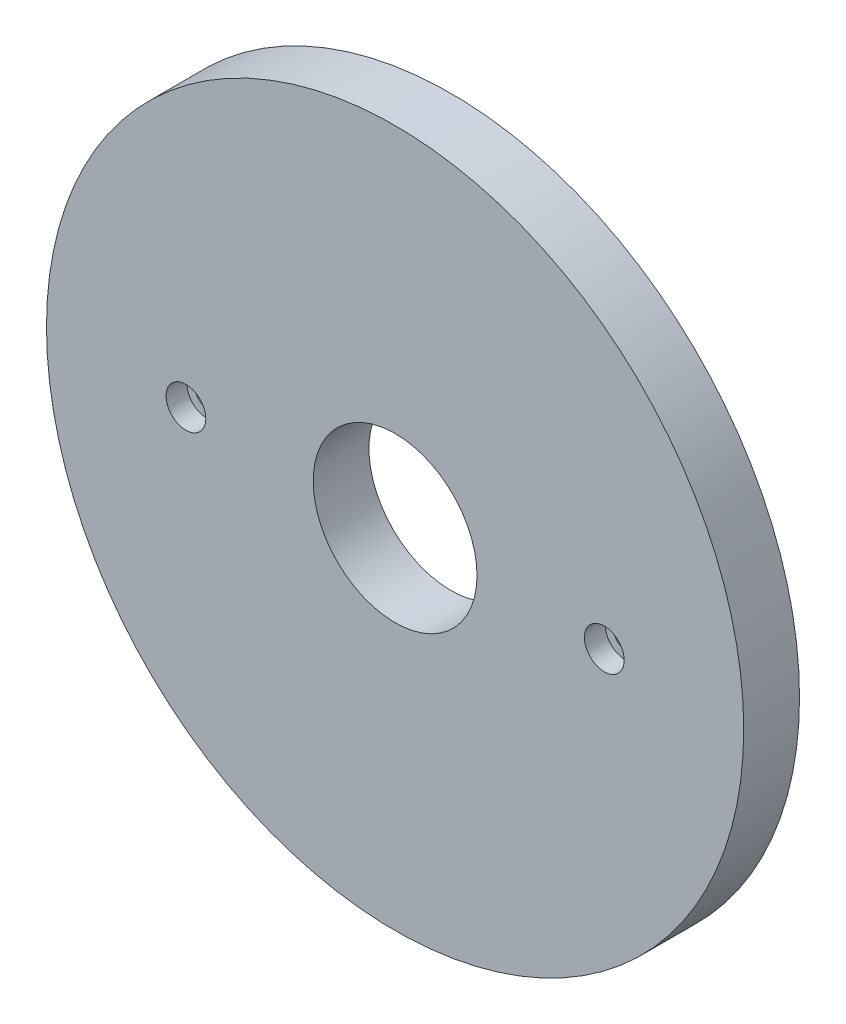
ISO-10303-21;
HEADER;
FILE_DESCRIPTION(('STEP AP214'),'2;1');
FILE_NAME('part.step','',(''),(''),'','','');
FILE_SCHEMA(('AUTOMOTIVE_DESIGN { 1 0 10303 214 1 1 1 1 }'));
ENDSEC;
DATA;
#1=APPLICATION_CONTEXT('core data for automotive mechanical design processes');
#2=APPLICATION_PROTOCOL_DEFINITION('international standard','automotive_design',2000,#1);
#3=PRODUCT_CONTEXT('',#1,'mechanical');
#4=PRODUCT('Part','Part','',(#3));
#5=PRODUCT_RELATED_PRODUCT_CATEGORY('part','',(#4));
#6=PRODUCT_DEFINITION_FORMATION('','',#4);
#7=PRODUCT_DEFINITION_CONTEXT('part definition',#1,'design');
#8=PRODUCT_DEFINITION('design','',#6,#7);
#9=PRODUCT_DEFINITION_SHAPE('','',#8);
#10=(LENGTH_UNIT() NAMED_UNIT(*) SI_UNIT(.MILLI.,.METRE.));
#11=(NAMED_UNIT(*) PLANE_ANGLE_UNIT() SI_UNIT($,.RADIAN.));
#12=(NAMED_UNIT(*) SI_UNIT($,.STERADIAN.) SOLID_ANGLE_UNIT());
#13=UNCERTAINTY_MEASURE_WITH_UNIT(LENGTH_MEASURE(1.E-05),#10,'distance_accuracy_value','');
#14=(GEOMETRIC_REPRESENTATION_CONTEXT(3) GLOBAL_UNCERTAINTY_ASSIGNED_CONTEXT((#13)) GLOBAL_UNIT_ASSIGNED_CONTEXT((#10,
#11,#12)) REPRESENTATION_CONTEXT('',''));
#15=CARTESIAN_POINT('',(0.,0.,0.));
#16=DIRECTION('',(0.,0.,1.));
#17=DIRECTION('',(1.,0.,0.));
#18=AXIS2_PLACEMENT_3D('',#15,#16,#17);
#19=CARTESIAN_POINT('',(-30.,0.,-8.));
#20=DIRECTION('',(0.,0.,1.));
#21=DIRECTION('',(1.,0.,0.));
#22=AXIS2_PLACEMENT_3D('',#19,#20,#21);
#23=CYLINDRICAL_SURFACE('',#22,1.6);
#24=CARTESIAN_POINT('',(-30.,0.,-8.));
#25=DIRECTION('',(0.,0.,1.));
#26=DIRECTION('',(1.,0.,0.));
#27=AXIS2_PLACEMENT_3D('',#24,#25,#26);
#28=CIRCLE('',#27,1.6);
#29=CARTESIAN_POINT('',(-28.4,0.,-8.));
#30=VERTEX_POINT('',#29);
#31=EDGE_CURVE('E55',#30,#30,#28,.T.);
#32=ORIENTED_EDGE('',*,*,#31,.F.);
#33=EDGE_LOOP('',(#32));
#34=FACE_BOUND('',#33,.T.);
#35=CARTESIAN_POINT('',(-30.,0.,-3.));
#36=DIRECTION('',(0.,0.,1.));
#37=DIRECTION('',(1.,0.,0.));
#38=AXIS2_PLACEMENT_3D('',#35,#36,#37);
#39=CIRCLE('',#38,1.6);
#40=CARTESIAN_POINT('',(-28.4,0.,-3.));
#41=VERTEX_POINT('',#40);
#42=EDGE_CURVE('E35',#41,#41,#39,.F.);
#43=ORIENTED_EDGE('',*,*,#42,.F.);
#44=EDGE_LOOP('',(#43));
#45=FACE_BOUND('',#44,.T.);
#46=ADVANCED_FACE('F31',(#34,#45),#23,.F.);
#47=CARTESIAN_POINT('',(30.,0.,-8.));
#48=DIRECTION('',(0.,0.,1.));
#49=DIRECTION('',(1.,0.,0.));
#50=AXIS2_PLACEMENT_3D('',#47,#48,#49);
#51=CYLINDRICAL_SURFACE('',#50,1.6);
#52=CARTESIAN_POINT('',(30.,0.,-8.));
#53=DIRECTION('',(0.,0.,1.));
#54=DIRECTION('',(1.,0.,0.));
#55=AXIS2_PLACEMENT_3D('',#52,#53,#54);
#56=CIRCLE('',#55,1.6);
#57=CARTESIAN_POINT('',(31.6,0.,-8.));
#58=VERTEX_POINT('',#57);
#59=EDGE_CURVE('E70',#58,#58,#56,.T.);
#60=ORIENTED_EDGE('',*,*,#59,.F.);
#61=EDGE_LOOP('',(#60));
#62=FACE_BOUND('',#61,.T.);
#63=CARTESIAN_POINT('',(30.,0.,-3.));
#64=DIRECTION('',(0.,0.,1.));
#65=DIRECTION('',(1.,0.,0.));
#66=AXIS2_PLACEMENT_3D('',#63,#64,#65);
#67=CIRCLE('',#66,1.6);
#68=CARTESIAN_POINT('',(31.6,0.,-3.));
#69=VERTEX_POINT('',#68);
#70=EDGE_CURVE('E49',#69,#69,#67,.F.);
#71=ORIENTED_EDGE('',*,*,#70,.F.);
#72=EDGE_LOOP('',(#71));
#73=FACE_BOUND('',#72,.T.);
#74=ADVANCED_FACE('F90',(#62,#73),#51,.F.);
#75=CARTESIAN_POINT('',(0.,0.,-8.));
#76=DIRECTION('',(0.,0.,1.));
#77=DIRECTION('',(1.,0.,0.));
#78=AXIS2_PLACEMENT_3D('',#75,#76,#77);
#79=CYLINDRICAL_SURFACE('',#78,50.);
#80=CARTESIAN_POINT('',(0.,0.,-8.));
#81=DIRECTION('',(0.,0.,1.));
#82=DIRECTION('',(1.,0.,0.));
#83=AXIS2_PLACEMENT_3D('',#80,#81,#82);
#84=CIRCLE('',#83,50.);
#85=CARTESIAN_POINT('',(50.,0.,-8.));
#86=VERTEX_POINT('',#85);
#87=EDGE_CURVE('E10',#86,#86,#84,.T.);
#88=ORIENTED_EDGE('',*,*,#87,.T.);
#89=EDGE_LOOP('',(#88));
#90=FACE_BOUND('',#89,.T.);
#91=CARTESIAN_POINT('',(0.,0.,0.));
#92=DIRECTION('',(0.,0.,1.));
#93=DIRECTION('',(1.,0.,0.));
#94=AXIS2_PLACEMENT_3D('',#91,#92,#93);
#95=CIRCLE('',#94,50.);
#96=CARTESIAN_POINT('',(50.,0.,0.));
#97=VERTEX_POINT('',#96);
#98=EDGE_CURVE('E39',#97,#97,#95,.T.);
#99=ORIENTED_EDGE('',*,*,#98,.F.);
#100=EDGE_LOOP('',(#99));
#101=FACE_BOUND('',#100,.T.);
#102=ADVANCED_FACE('F33',(#90,#101),#79,.T.);
#103=CARTESIAN_POINT('',(0.,0.,-8.));
#104=DIRECTION('',(0.,0.,1.));
#105=DIRECTION('',(1.,0.,0.));
#106=AXIS2_PLACEMENT_3D('',#103,#104,#105);
#107=PLANE('',#106);
#108=ORIENTED_EDGE('',*,*,#59,.T.);
#109=EDGE_LOOP('',(#108));
#110=FACE_BOUND('',#109,.T.);
#111=ORIENTED_EDGE('',*,*,#31,.T.);
#112=EDGE_LOOP('',(#111));
#113=FACE_BOUND('',#112,.T.);
#114=CARTESIAN_POINT('',(0.,0.,-8.));
#115=DIRECTION('',(0.,0.,1.));
#116=DIRECTION('',(1.,0.,0.));
#117=AXIS2_PLACEMENT_3D('',#114,#115,#116);
#118=CIRCLE('',#117,11.75);
#119=CARTESIAN_POINT('',(11.75,0.,-8.));
#120=VERTEX_POINT('',#119);
#121=EDGE_CURVE('E44',#120,#120,#118,.T.);
#122=ORIENTED_EDGE('',*,*,#121,.T.);
#123=EDGE_LOOP('',(#122));
#124=FACE_BOUND('',#123,.T.);
#125=ORIENTED_EDGE('',*,*,#87,.F.);
#126=EDGE_LOOP('',(#125));
#127=FACE_BOUND('',#126,.T.);
#128=ADVANCED_FACE('F85',(#110,#113,#124,#127),#107,.F.);
#129=CARTESIAN_POINT('',(0.,0.,0.));
#130=DIRECTION('',(0.,0.,1.));
#131=DIRECTION('',(1.,0.,0.));
#132=AXIS2_PLACEMENT_3D('',#129,#130,#131);
#133=PLANE('',#132);
#134=CARTESIAN_POINT('',(30.,0.,0.));
#135=DIRECTION('',(0.,0.,1.));
#136=DIRECTION('',(1.,0.,0.));
#137=AXIS2_PLACEMENT_3D('',#134,#135,#136);
#138=CIRCLE('',#137,2.85);
#139=CARTESIAN_POINT('',(32.85,0.,0.));
#140=VERTEX_POINT('',#139);
#141=EDGE_CURVE('E57',#140,#140,#138,.T.);
#142=ORIENTED_EDGE('',*,*,#141,.F.);
#143=EDGE_LOOP('',(#142));
#144=FACE_BOUND('',#143,.T.);
#145=CARTESIAN_POINT('',(-30.,0.,0.));
#146=DIRECTION('',(0.,0.,1.));
#147=DIRECTION('',(1.,0.,0.));
#148=AXIS2_PLACEMENT_3D('',#145,#146,#147);
#149=CIRCLE('',#148,2.85);
#150=CARTESIAN_POINT('',(-27.15,0.,0.));
#151=VERTEX_POINT('',#150);
#152=EDGE_CURVE('E67',#151,#151,#149,.T.);
#153=ORIENTED_EDGE('',*,*,#152,.F.);
#154=EDGE_LOOP('',(#153));
#155=FACE_BOUND('',#154,.T.);
#156=CARTESIAN_POINT('',(0.,0.,0.));
#157=DIRECTION('',(0.,0.,1.));
#158=DIRECTION('',(1.,0.,0.));
#159=AXIS2_PLACEMENT_3D('',#156,#157,#158);
#160=CIRCLE('',#159,11.75);
#161=CARTESIAN_POINT('',(11.75,0.,0.));
#162=VERTEX_POINT('',#161);
#163=EDGE_CURVE('E47',#162,#162,#160,.T.);
#164=ORIENTED_EDGE('',*,*,#163,.F.);
#165=EDGE_LOOP('',(#164));
#166=FACE_BOUND('',#165,.T.);
#167=ORIENTED_EDGE('',*,*,#98,.T.);
#168=EDGE_LOOP('',(#167));
#169=FACE_BOUND('',#168,.T.);
#170=ADVANCED_FACE('F82',(#144,#155,#166,#169),#133,.T.);
#171=CARTESIAN_POINT('',(0.,0.,-8.));
#172=DIRECTION('',(0.,0.,1.));
#173=DIRECTION('',(1.,0.,0.));
#174=AXIS2_PLACEMENT_3D('',#171,#172,#173);
#175=CYLINDRICAL_SURFACE('',#174,11.75);
#176=ORIENTED_EDGE('',*,*,#121,.F.);
#177=EDGE_LOOP('',(#176));
#178=FACE_BOUND('',#177,.T.);
#179=ORIENTED_EDGE('',*,*,#163,.T.);
#180=EDGE_LOOP('',(#179));
#181=FACE_BOUND('',#180,.T.);
#182=ADVANCED_FACE('F80',(#178,#181),#175,.F.);
#183=CARTESIAN_POINT('',(30.,0.,-3.));
#184=DIRECTION('',(0.,0.,1.));
#185=DIRECTION('',(1.,0.,0.));
#186=AXIS2_PLACEMENT_3D('',#183,#184,#185);
#187=PLANE('',#186);
#188=CARTESIAN_POINT('',(30.,0.,-3.));
#189=DIRECTION('',(0.,0.,1.));
#190=DIRECTION('',(1.,0.,0.));
#191=AXIS2_PLACEMENT_3D('',#188,#189,#190);
#192=CIRCLE('',#191,2.85);
#193=CARTESIAN_POINT('',(32.85,0.,-3.));
#194=VERTEX_POINT('',#193);
#195=EDGE_CURVE('E51',#194,#194,#192,.T.);
#196=ORIENTED_EDGE('',*,*,#195,.T.);
#197=EDGE_LOOP('',(#196));
#198=FACE_BOUND('',#197,.T.);
#199=ORIENTED_EDGE('',*,*,#70,.T.);
#200=EDGE_LOOP('',(#199));
#201=FACE_BOUND('',#200,.T.);
#202=ADVANCED_FACE('F109',(#198,#201),#187,.T.);
#203=CARTESIAN_POINT('',(30.,0.,-3.));
#204=DIRECTION('',(0.,0.,1.));
#205=DIRECTION('',(1.,0.,0.));
#206=AXIS2_PLACEMENT_3D('',#203,#204,#205);
#207=CYLINDRICAL_SURFACE('',#206,2.85);
#208=ORIENTED_EDGE('',*,*,#195,.F.);
#209=EDGE_LOOP('',(#208));
#210=FACE_BOUND('',#209,.T.);
#211=ORIENTED_EDGE('',*,*,#141,.T.);
#212=EDGE_LOOP('',(#211));
#213=FACE_BOUND('',#212,.T.);
#214=ADVANCED_FACE('F114',(#210,#213),#207,.F.);
#215=CARTESIAN_POINT('',(-30.,0.,-3.));
#216=DIRECTION('',(0.,0.,1.));
#217=DIRECTION('',(1.,0.,0.));
#218=AXIS2_PLACEMENT_3D('',#215,#216,#217);
#219=PLANE('',#218);
#220=CARTESIAN_POINT('',(-30.,0.,-3.));
#221=DIRECTION('',(0.,0.,1.));
#222=DIRECTION('',(1.,0.,0.));
#223=AXIS2_PLACEMENT_3D('',#220,#221,#222);
#224=CIRCLE('',#223,2.85);
#225=CARTESIAN_POINT('',(-27.15,0.,-3.));
#226=VERTEX_POINT('',#225);
#227=EDGE_CURVE('E62',#226,#226,#224,.T.);
#228=ORIENTED_EDGE('',*,*,#227,.T.);
#229=EDGE_LOOP('',(#228));
#230=FACE_BOUND('',#229,.T.);
#231=ORIENTED_EDGE('',*,*,#42,.T.);
#232=EDGE_LOOP('',(#231));
#233=FACE_BOUND('',#232,.T.);
#234=ADVANCED_FACE('F119',(#230,#233),#219,.T.);
#235=CARTESIAN_POINT('',(-30.,0.,-3.));
#236=DIRECTION('',(0.,0.,1.));
#237=DIRECTION('',(1.,0.,0.));
#238=AXIS2_PLACEMENT_3D('',#235,#236,#237);
#239=CYLINDRICAL_SURFACE('',#238,2.85);
#240=ORIENTED_EDGE('',*,*,#227,.F.);
#241=EDGE_LOOP('',(#240));
#242=FACE_BOUND('',#241,.T.);
#243=ORIENTED_EDGE('',*,*,#152,.T.);
#244=EDGE_LOOP('',(#243));
#245=FACE_BOUND('',#244,.T.);
#246=ADVANCED_FACE('F124',(#242,#245),#239,.F.);
#247=CLOSED_SHELL('',(#46,#74,#102,#128,#170,#182,#202,#214,#234,#246));
#248=MANIFOLD_SOLID_BREP('B2',#247);
#249=ADVANCED_BREP_SHAPE_REPRESENTATION('',(#18,#248),#14);
#250=SHAPE_DEFINITION_REPRESENTATION(#9,#249);
ENDSEC;
END-ISO-10303-21;
